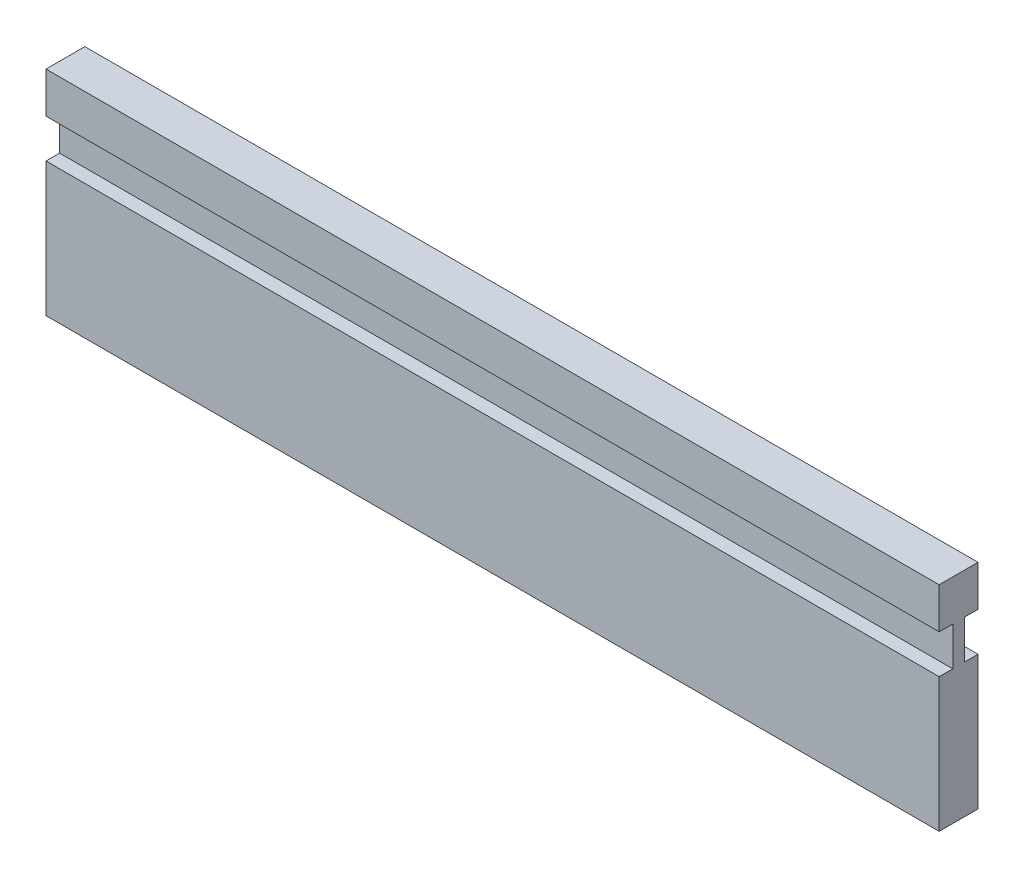
ISO-10303-21;
HEADER;
FILE_DESCRIPTION(('STEP AP214'),'2;1');
FILE_NAME('part.step','',(''),(''),'','','');
FILE_SCHEMA(('AUTOMOTIVE_DESIGN { 1 0 10303 214 1 1 1 1 }'));
ENDSEC;
DATA;
#1=APPLICATION_CONTEXT('core data for automotive mechanical design processes');
#2=APPLICATION_PROTOCOL_DEFINITION('international standard','automotive_design',2000,#1);
#3=PRODUCT_CONTEXT('',#1,'mechanical');
#4=PRODUCT('Part','Part','',(#3));
#5=PRODUCT_RELATED_PRODUCT_CATEGORY('part','',(#4));
#6=PRODUCT_DEFINITION_FORMATION('','',#4);
#7=PRODUCT_DEFINITION_CONTEXT('part definition',#1,'design');
#8=PRODUCT_DEFINITION('design','',#6,#7);
#9=PRODUCT_DEFINITION_SHAPE('','',#8);
#10=(LENGTH_UNIT() NAMED_UNIT(*) SI_UNIT(.MILLI.,.METRE.));
#11=(NAMED_UNIT(*) PLANE_ANGLE_UNIT() SI_UNIT($,.RADIAN.));
#12=(NAMED_UNIT(*) SI_UNIT($,.STERADIAN.) SOLID_ANGLE_UNIT());
#13=UNCERTAINTY_MEASURE_WITH_UNIT(LENGTH_MEASURE(1.E-05),#10,'distance_accuracy_value','');
#14=(GEOMETRIC_REPRESENTATION_CONTEXT(3) GLOBAL_UNCERTAINTY_ASSIGNED_CONTEXT((#13)) GLOBAL_UNIT_ASSIGNED_CONTEXT((#10,
#11,#12)) REPRESENTATION_CONTEXT('',''));
#15=CARTESIAN_POINT('',(0.,0.,0.));
#16=DIRECTION('',(0.,0.,1.));
#17=DIRECTION('',(1.,0.,0.));
#18=AXIS2_PLACEMENT_3D('',#15,#16,#17);
#19=CARTESIAN_POINT('',(0.,0.,0.));
#20=DIRECTION('',(0.,0.,1.));
#21=DIRECTION('',(1.,0.,0.));
#22=AXIS2_PLACEMENT_3D('',#19,#20,#21);
#23=PLANE('',#22);
#24=DIRECTION('',(0.,-1.,0.));
#25=VECTOR('',#24,1.);
#26=CARTESIAN_POINT('',(-230.,-55.,0.));
#27=LINE('',#26,#25);
#28=CARTESIAN_POINT('',(-230.,14.,0.));
#29=VERTEX_POINT('',#28);
#30=CARTESIAN_POINT('',(-230.,-55.,0.));
#31=VERTEX_POINT('',#30);
#32=EDGE_CURVE('E196',#29,#31,#27,.T.);
#33=ORIENTED_EDGE('',*,*,#32,.F.);
#34=DIRECTION('',(1.,0.,0.));
#35=VECTOR('',#34,1.);
#36=CARTESIAN_POINT('',(0.,14.,0.));
#37=LINE('',#36,#35);
#38=CARTESIAN_POINT('',(230.,14.,0.));
#39=VERTEX_POINT('',#38);
#40=EDGE_CURVE('E48',#29,#39,#37,.T.);
#41=ORIENTED_EDGE('',*,*,#40,.T.);
#42=DIRECTION('',(0.,1.,0.));
#43=VECTOR('',#42,1.);
#44=CARTESIAN_POINT('',(230.,-55.,0.));
#45=LINE('',#44,#43);
#46=CARTESIAN_POINT('',(230.,-55.,0.));
#47=VERTEX_POINT('',#46);
#48=EDGE_CURVE('E220',#47,#39,#45,.T.);
#49=ORIENTED_EDGE('',*,*,#48,.F.);
#50=DIRECTION('',(1.,0.,0.));
#51=VECTOR('',#50,1.);
#52=CARTESIAN_POINT('',(230.,-55.,0.));
#53=LINE('',#52,#51);
#54=EDGE_CURVE('E216',#31,#47,#53,.T.);
#55=ORIENTED_EDGE('',*,*,#54,.F.);
#56=EDGE_LOOP('',(#33,#41,#49,#55));
#57=FACE_BOUND('',#56,.T.);
#58=ADVANCED_FACE('F39',(#57),#23,.F.);
#59=CARTESIAN_POINT('',(0.,0.,20.));
#60=DIRECTION('',(0.,0.,1.));
#61=DIRECTION('',(1.,0.,0.));
#62=AXIS2_PLACEMENT_3D('',#59,#60,#61);
#63=PLANE('',#62);
#64=DIRECTION('',(1.,0.,0.));
#65=VECTOR('',#64,1.);
#66=CARTESIAN_POINT('',(0.,14.,20.));
#67=LINE('',#66,#65);
#68=CARTESIAN_POINT('',(-230.,14.,20.));
#69=VERTEX_POINT('',#68);
#70=CARTESIAN_POINT('',(230.,14.,20.));
#71=VERTEX_POINT('',#70);
#72=EDGE_CURVE('E241',#69,#71,#67,.T.);
#73=ORIENTED_EDGE('',*,*,#72,.F.);
#74=DIRECTION('',(0.,-1.,0.));
#75=VECTOR('',#74,1.);
#76=CARTESIAN_POINT('',(-230.,-55.,20.));
#77=LINE('',#76,#75);
#78=CARTESIAN_POINT('',(-230.,-55.,20.));
#79=VERTEX_POINT('',#78);
#80=EDGE_CURVE('E202',#69,#79,#77,.T.);
#81=ORIENTED_EDGE('',*,*,#80,.T.);
#82=DIRECTION('',(1.,0.,0.));
#83=VECTOR('',#82,1.);
#84=CARTESIAN_POINT('',(230.,-55.,20.));
#85=LINE('',#84,#83);
#86=CARTESIAN_POINT('',(230.,-55.,20.));
#87=VERTEX_POINT('',#86);
#88=EDGE_CURVE('E201',#79,#87,#85,.T.);
#89=ORIENTED_EDGE('',*,*,#88,.T.);
#90=DIRECTION('',(0.,1.,0.));
#91=VECTOR('',#90,1.);
#92=CARTESIAN_POINT('',(230.,-55.,20.));
#93=LINE('',#92,#91);
#94=EDGE_CURVE('E206',#87,#71,#93,.T.);
#95=ORIENTED_EDGE('',*,*,#94,.T.);
#96=EDGE_LOOP('',(#73,#81,#89,#95));
#97=FACE_BOUND('',#96,.T.);
#98=ADVANCED_FACE('F284',(#97),#63,.T.);
#99=CARTESIAN_POINT('',(-230.,-55.,20.));
#100=DIRECTION('',(1.,0.,0.));
#101=DIRECTION('',(0.,0.,-1.));
#102=AXIS2_PLACEMENT_3D('',#99,#100,#101);
#103=PLANE('',#102);
#104=DIRECTION('',(0.,1.,0.));
#105=VECTOR('',#104,1.);
#106=CARTESIAN_POINT('',(-230.,34.,7.));
#107=LINE('',#106,#105);
#108=CARTESIAN_POINT('',(-230.,14.,7.));
#109=VERTEX_POINT('',#108);
#110=CARTESIAN_POINT('',(-230.,34.,7.));
#111=VERTEX_POINT('',#110);
#112=EDGE_CURVE('E135',#109,#111,#107,.T.);
#113=ORIENTED_EDGE('',*,*,#112,.F.);
#114=DIRECTION('',(0.,0.,-1.));
#115=VECTOR('',#114,1.);
#116=CARTESIAN_POINT('',(-230.,14.,7.));
#117=LINE('',#116,#115);
#118=EDGE_CURVE('E151',#109,#29,#117,.T.);
#119=ORIENTED_EDGE('',*,*,#118,.T.);
#120=ORIENTED_EDGE('',*,*,#32,.T.);
#121=DIRECTION('',(0.,0.,-1.));
#122=VECTOR('',#121,1.);
#123=CARTESIAN_POINT('',(-230.,-55.,20.));
#124=LINE('',#123,#122);
#125=EDGE_CURVE('E237',#79,#31,#124,.T.);
#126=ORIENTED_EDGE('',*,*,#125,.F.);
#127=ORIENTED_EDGE('',*,*,#80,.F.);
#128=DIRECTION('',(0.,0.,-1.));
#129=VECTOR('',#128,1.);
#130=CARTESIAN_POINT('',(-230.,14.,20.));
#131=LINE('',#130,#129);
#132=CARTESIAN_POINT('',(-230.,14.,13.));
#133=VERTEX_POINT('',#132);
#134=EDGE_CURVE('E189',#69,#133,#131,.T.);
#135=ORIENTED_EDGE('',*,*,#134,.T.);
#136=DIRECTION('',(0.,-1.,0.));
#137=VECTOR('',#136,1.);
#138=CARTESIAN_POINT('',(-230.,-55.,13.));
#139=LINE('',#138,#137);
#140=CARTESIAN_POINT('',(-230.,34.,13.));
#141=VERTEX_POINT('',#140);
#142=EDGE_CURVE('E193',#141,#133,#139,.T.);
#143=ORIENTED_EDGE('',*,*,#142,.F.);
#144=DIRECTION('',(0.,0.,1.));
#145=VECTOR('',#144,1.);
#146=CARTESIAN_POINT('',(-230.,34.,20.));
#147=LINE('',#146,#145);
#148=CARTESIAN_POINT('',(-230.,34.,20.));
#149=VERTEX_POINT('',#148);
#150=EDGE_CURVE('E183',#141,#149,#147,.T.);
#151=ORIENTED_EDGE('',*,*,#150,.T.);
#152=CARTESIAN_POINT('',(-230.,55.,20.));
#153=VERTEX_POINT('',#152);
#154=EDGE_CURVE('E197',#153,#149,#77,.T.);
#155=ORIENTED_EDGE('',*,*,#154,.F.);
#156=DIRECTION('',(0.,0.,-1.));
#157=VECTOR('',#156,1.);
#158=CARTESIAN_POINT('',(-230.,55.,20.));
#159=LINE('',#158,#157);
#160=CARTESIAN_POINT('',(-230.,55.,0.));
#161=VERTEX_POINT('',#160);
#162=EDGE_CURVE('E213',#153,#161,#159,.T.);
#163=ORIENTED_EDGE('',*,*,#162,.T.);
#164=CARTESIAN_POINT('',(-230.,34.,0.));
#165=VERTEX_POINT('',#164);
#166=EDGE_CURVE('E149',#161,#165,#27,.T.);
#167=ORIENTED_EDGE('',*,*,#166,.T.);
#168=DIRECTION('',(0.,0.,-1.));
#169=VECTOR('',#168,1.);
#170=CARTESIAN_POINT('',(-230.,34.,7.));
#171=LINE('',#170,#169);
#172=EDGE_CURVE('E55',#111,#165,#171,.T.);
#173=ORIENTED_EDGE('',*,*,#172,.F.);
#174=EDGE_LOOP('',(#113,#119,#120,#126,#127,#135,#143,#151,#155,#163,#167,#173));
#175=FACE_BOUND('',#174,.T.);
#176=ADVANCED_FACE('F41',(#175),#103,.F.);
#177=CARTESIAN_POINT('',(230.,-55.,20.));
#178=DIRECTION('',(0.,1.,0.));
#179=DIRECTION('',(-1.,0.,0.));
#180=AXIS2_PLACEMENT_3D('',#177,#178,#179);
#181=PLANE('',#180);
#182=ORIENTED_EDGE('',*,*,#54,.T.);
#183=DIRECTION('',(0.,0.,-1.));
#184=VECTOR('',#183,1.);
#185=CARTESIAN_POINT('',(230.,-55.,20.));
#186=LINE('',#185,#184);
#187=EDGE_CURVE('E233',#87,#47,#186,.T.);
#188=ORIENTED_EDGE('',*,*,#187,.F.);
#189=ORIENTED_EDGE('',*,*,#88,.F.);
#190=ORIENTED_EDGE('',*,*,#125,.T.);
#191=EDGE_LOOP('',(#182,#188,#189,#190));
#192=FACE_BOUND('',#191,.T.);
#193=ADVANCED_FACE('F256',(#192),#181,.F.);
#194=CARTESIAN_POINT('',(230.,-55.,20.));
#195=DIRECTION('',(-1.,0.,0.));
#196=DIRECTION('',(0.,0.,1.));
#197=AXIS2_PLACEMENT_3D('',#194,#195,#196);
#198=PLANE('',#197);
#199=ORIENTED_EDGE('',*,*,#48,.T.);
#200=DIRECTION('',(0.,0.,1.));
#201=VECTOR('',#200,1.);
#202=CARTESIAN_POINT('',(230.,14.,20.));
#203=LINE('',#202,#201);
#204=CARTESIAN_POINT('',(230.,14.,7.));
#205=VERTEX_POINT('',#204);
#206=EDGE_CURVE('E161',#39,#205,#203,.T.);
#207=ORIENTED_EDGE('',*,*,#206,.T.);
#208=DIRECTION('',(0.,-1.,0.));
#209=VECTOR('',#208,1.);
#210=CARTESIAN_POINT('',(230.,-55.,7.));
#211=LINE('',#210,#209);
#212=CARTESIAN_POINT('',(230.,34.,7.));
#213=VERTEX_POINT('',#212);
#214=EDGE_CURVE('E11',#213,#205,#211,.T.);
#215=ORIENTED_EDGE('',*,*,#214,.F.);
#216=DIRECTION('',(0.,0.,-1.));
#217=VECTOR('',#216,1.);
#218=CARTESIAN_POINT('',(230.,34.,20.));
#219=LINE('',#218,#217);
#220=CARTESIAN_POINT('',(230.,34.,0.));
#221=VERTEX_POINT('',#220);
#222=EDGE_CURVE('E130',#213,#221,#219,.T.);
#223=ORIENTED_EDGE('',*,*,#222,.T.);
#224=CARTESIAN_POINT('',(230.,55.,0.));
#225=VERTEX_POINT('',#224);
#226=EDGE_CURVE('E219',#221,#225,#45,.T.);
#227=ORIENTED_EDGE('',*,*,#226,.T.);
#228=DIRECTION('',(0.,0.,-1.));
#229=VECTOR('',#228,1.);
#230=CARTESIAN_POINT('',(230.,55.,20.));
#231=LINE('',#230,#229);
#232=CARTESIAN_POINT('',(230.,55.,20.));
#233=VERTEX_POINT('',#232);
#234=EDGE_CURVE('E229',#233,#225,#231,.T.);
#235=ORIENTED_EDGE('',*,*,#234,.F.);
#236=CARTESIAN_POINT('',(230.,34.,20.));
#237=VERTEX_POINT('',#236);
#238=EDGE_CURVE('E205',#237,#233,#93,.T.);
#239=ORIENTED_EDGE('',*,*,#238,.F.);
#240=DIRECTION('',(0.,0.,1.));
#241=VECTOR('',#240,1.);
#242=CARTESIAN_POINT('',(230.,34.,13.));
#243=LINE('',#242,#241);
#244=CARTESIAN_POINT('',(230.,34.,13.));
#245=VERTEX_POINT('',#244);
#246=EDGE_CURVE('E63',#245,#237,#243,.T.);
#247=ORIENTED_EDGE('',*,*,#246,.F.);
#248=DIRECTION('',(0.,1.,0.));
#249=VECTOR('',#248,1.);
#250=CARTESIAN_POINT('',(230.,34.,13.));
#251=LINE('',#250,#249);
#252=CARTESIAN_POINT('',(230.,14.,13.));
#253=VERTEX_POINT('',#252);
#254=EDGE_CURVE('E166',#253,#245,#251,.T.);
#255=ORIENTED_EDGE('',*,*,#254,.F.);
#256=DIRECTION('',(0.,0.,1.));
#257=VECTOR('',#256,1.);
#258=CARTESIAN_POINT('',(230.,14.,13.));
#259=LINE('',#258,#257);
#260=EDGE_CURVE('E179',#253,#71,#259,.T.);
#261=ORIENTED_EDGE('',*,*,#260,.T.);
#262=ORIENTED_EDGE('',*,*,#94,.F.);
#263=ORIENTED_EDGE('',*,*,#187,.T.);
#264=EDGE_LOOP('',(#199,#207,#215,#223,#227,#235,#239,#247,#255,#261,#262,#263));
#265=FACE_BOUND('',#264,.T.);
#266=ADVANCED_FACE('F251',(#265),#198,.F.);
#267=CARTESIAN_POINT('',(230.,55.,20.));
#268=DIRECTION('',(0.,-1.,0.));
#269=DIRECTION('',(1.,0.,0.));
#270=AXIS2_PLACEMENT_3D('',#267,#268,#269);
#271=PLANE('',#270);
#272=DIRECTION('',(-1.,0.,0.));
#273=VECTOR('',#272,1.);
#274=CARTESIAN_POINT('',(230.,55.,0.));
#275=LINE('',#274,#273);
#276=EDGE_CURVE('E224',#225,#161,#275,.T.);
#277=ORIENTED_EDGE('',*,*,#276,.T.);
#278=ORIENTED_EDGE('',*,*,#162,.F.);
#279=DIRECTION('',(-1.,0.,0.));
#280=VECTOR('',#279,1.);
#281=CARTESIAN_POINT('',(230.,55.,20.));
#282=LINE('',#281,#280);
#283=EDGE_CURVE('E210',#233,#153,#282,.T.);
#284=ORIENTED_EDGE('',*,*,#283,.F.);
#285=ORIENTED_EDGE('',*,*,#234,.T.);
#286=EDGE_LOOP('',(#277,#278,#284,#285));
#287=FACE_BOUND('',#286,.T.);
#288=ADVANCED_FACE('F272',(#287),#271,.F.);
#289=DIRECTION('',(-1.,0.,0.));
#290=VECTOR('',#289,1.);
#291=CARTESIAN_POINT('',(-250.,34.,20.));
#292=LINE('',#291,#290);
#293=EDGE_CURVE('E165',#237,#149,#292,.T.);
#294=ORIENTED_EDGE('',*,*,#293,.F.);
#295=ORIENTED_EDGE('',*,*,#238,.T.);
#296=ORIENTED_EDGE('',*,*,#283,.T.);
#297=ORIENTED_EDGE('',*,*,#154,.T.);
#298=EDGE_LOOP('',(#294,#295,#296,#297));
#299=FACE_BOUND('',#298,.T.);
#300=ADVANCED_FACE('F266',(#299),#63,.T.);
#301=ORIENTED_EDGE('',*,*,#226,.F.);
#302=DIRECTION('',(1.,0.,0.));
#303=VECTOR('',#302,1.);
#304=CARTESIAN_POINT('',(240.,34.,0.));
#305=LINE('',#304,#303);
#306=EDGE_CURVE('E144',#165,#221,#305,.T.);
#307=ORIENTED_EDGE('',*,*,#306,.F.);
#308=ORIENTED_EDGE('',*,*,#166,.F.);
#309=ORIENTED_EDGE('',*,*,#276,.F.);
#310=EDGE_LOOP('',(#301,#307,#308,#309));
#311=FACE_BOUND('',#310,.T.);
#312=ADVANCED_FACE('F293',(#311),#23,.F.);
#313=CARTESIAN_POINT('',(0.,0.,13.));
#314=DIRECTION('',(0.,0.,1.));
#315=DIRECTION('',(1.,0.,0.));
#316=AXIS2_PLACEMENT_3D('',#313,#314,#315);
#317=PLANE('',#316);
#318=ORIENTED_EDGE('',*,*,#142,.T.);
#319=DIRECTION('',(1.,0.,0.));
#320=VECTOR('',#319,1.);
#321=CARTESIAN_POINT('',(-250.,14.,13.));
#322=LINE('',#321,#320);
#323=EDGE_CURVE('E174',#133,#253,#322,.T.);
#324=ORIENTED_EDGE('',*,*,#323,.T.);
#325=ORIENTED_EDGE('',*,*,#254,.T.);
#326=DIRECTION('',(-1.,0.,0.));
#327=VECTOR('',#326,1.);
#328=CARTESIAN_POINT('',(-250.,34.,13.));
#329=LINE('',#328,#327);
#330=EDGE_CURVE('E170',#245,#141,#329,.T.);
#331=ORIENTED_EDGE('',*,*,#330,.T.);
#332=EDGE_LOOP('',(#318,#324,#325,#331));
#333=FACE_BOUND('',#332,.T.);
#334=ADVANCED_FACE('F277',(#333),#317,.T.);
#335=CARTESIAN_POINT('',(-250.,14.,13.));
#336=DIRECTION('',(0.,-1.,0.));
#337=DIRECTION('',(0.,0.,-1.));
#338=AXIS2_PLACEMENT_3D('',#335,#336,#337);
#339=PLANE('',#338);
#340=ORIENTED_EDGE('',*,*,#72,.T.);
#341=ORIENTED_EDGE('',*,*,#260,.F.);
#342=ORIENTED_EDGE('',*,*,#323,.F.);
#343=ORIENTED_EDGE('',*,*,#134,.F.);
#344=EDGE_LOOP('',(#340,#341,#342,#343));
#345=FACE_BOUND('',#344,.T.);
#346=ADVANCED_FACE('F285',(#345),#339,.F.);
#347=CARTESIAN_POINT('',(-250.,34.,13.));
#348=DIRECTION('',(0.,1.,0.));
#349=DIRECTION('',(0.,0.,1.));
#350=AXIS2_PLACEMENT_3D('',#347,#348,#349);
#351=PLANE('',#350);
#352=ORIENTED_EDGE('',*,*,#330,.F.);
#353=ORIENTED_EDGE('',*,*,#246,.T.);
#354=ORIENTED_EDGE('',*,*,#293,.T.);
#355=ORIENTED_EDGE('',*,*,#150,.F.);
#356=EDGE_LOOP('',(#352,#353,#354,#355));
#357=FACE_BOUND('',#356,.T.);
#358=ADVANCED_FACE('F275',(#357),#351,.F.);
#359=CARTESIAN_POINT('',(0.,0.,7.));
#360=DIRECTION('',(0.,0.,-1.));
#361=DIRECTION('',(-1.,0.,0.));
#362=AXIS2_PLACEMENT_3D('',#359,#360,#361);
#363=PLANE('',#362);
#364=ORIENTED_EDGE('',*,*,#214,.T.);
#365=DIRECTION('',(-1.,0.,0.));
#366=VECTOR('',#365,1.);
#367=CARTESIAN_POINT('',(240.,14.,7.));
#368=LINE('',#367,#366);
#369=EDGE_CURVE('E134',#205,#109,#368,.T.);
#370=ORIENTED_EDGE('',*,*,#369,.T.);
#371=ORIENTED_EDGE('',*,*,#112,.T.);
#372=DIRECTION('',(1.,0.,0.));
#373=VECTOR('',#372,1.);
#374=CARTESIAN_POINT('',(240.,34.,7.));
#375=LINE('',#374,#373);
#376=EDGE_CURVE('E126',#111,#213,#375,.T.);
#377=ORIENTED_EDGE('',*,*,#376,.T.);
#378=EDGE_LOOP('',(#364,#370,#371,#377));
#379=FACE_BOUND('',#378,.T.);
#380=ADVANCED_FACE('F138',(#379),#363,.T.);
#381=CARTESIAN_POINT('',(240.,14.,7.));
#382=DIRECTION('',(0.,-1.,0.));
#383=DIRECTION('',(1.,0.,0.));
#384=AXIS2_PLACEMENT_3D('',#381,#382,#383);
#385=PLANE('',#384);
#386=ORIENTED_EDGE('',*,*,#40,.F.);
#387=ORIENTED_EDGE('',*,*,#118,.F.);
#388=ORIENTED_EDGE('',*,*,#369,.F.);
#389=ORIENTED_EDGE('',*,*,#206,.F.);
#390=EDGE_LOOP('',(#386,#387,#388,#389));
#391=FACE_BOUND('',#390,.T.);
#392=ADVANCED_FACE('F308',(#391),#385,.F.);
#393=CARTESIAN_POINT('',(240.,34.,7.));
#394=DIRECTION('',(0.,1.,0.));
#395=DIRECTION('',(0.,0.,1.));
#396=AXIS2_PLACEMENT_3D('',#393,#394,#395);
#397=PLANE('',#396);
#398=ORIENTED_EDGE('',*,*,#376,.F.);
#399=ORIENTED_EDGE('',*,*,#172,.T.);
#400=ORIENTED_EDGE('',*,*,#306,.T.);
#401=ORIENTED_EDGE('',*,*,#222,.F.);
#402=EDGE_LOOP('',(#398,#399,#400,#401));
#403=FACE_BOUND('',#402,.T.);
#404=ADVANCED_FACE('F128',(#403),#397,.F.);
#405=CLOSED_SHELL('',(#58,#98,#176,#193,#266,#288,#300,#312,#334,#346,#358,#380,#392,#404));
#406=MANIFOLD_SOLID_BREP('B2',#405);
#407=ADVANCED_BREP_SHAPE_REPRESENTATION('',(#18,#406),#14);
#408=SHAPE_DEFINITION_REPRESENTATION(#9,#407);
ENDSEC;
END-ISO-10303-21;
